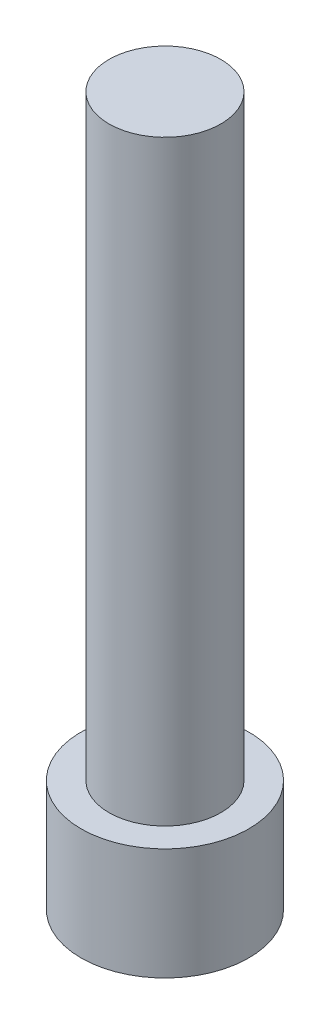
ISO-10303-21;
HEADER;
FILE_DESCRIPTION(('STEP AP214'),'2;1');
FILE_NAME('part.step','',(''),(''),'','','');
FILE_SCHEMA(('AUTOMOTIVE_DESIGN { 1 0 10303 214 1 1 1 1 }'));
ENDSEC;
DATA;
#1=APPLICATION_CONTEXT('core data for automotive mechanical design processes');
#2=APPLICATION_PROTOCOL_DEFINITION('international standard','automotive_design',2000,#1);
#3=PRODUCT_CONTEXT('',#1,'mechanical');
#4=PRODUCT('Part','Part','',(#3));
#5=PRODUCT_RELATED_PRODUCT_CATEGORY('part','',(#4));
#6=PRODUCT_DEFINITION_FORMATION('','',#4);
#7=PRODUCT_DEFINITION_CONTEXT('part definition',#1,'design');
#8=PRODUCT_DEFINITION('design','',#6,#7);
#9=PRODUCT_DEFINITION_SHAPE('','',#8);
#10=(LENGTH_UNIT() NAMED_UNIT(*) SI_UNIT(.MILLI.,.METRE.));
#11=(NAMED_UNIT(*) PLANE_ANGLE_UNIT() SI_UNIT($,.RADIAN.));
#12=(NAMED_UNIT(*) SI_UNIT($,.STERADIAN.) SOLID_ANGLE_UNIT());
#13=UNCERTAINTY_MEASURE_WITH_UNIT(LENGTH_MEASURE(1.E-05),#10,'distance_accuracy_value','');
#14=(GEOMETRIC_REPRESENTATION_CONTEXT(3) GLOBAL_UNCERTAINTY_ASSIGNED_CONTEXT((#13)) GLOBAL_UNIT_ASSIGNED_CONTEXT((#10,
#11,#12)) REPRESENTATION_CONTEXT('',''));
#15=CARTESIAN_POINT('',(0.,0.,0.));
#16=DIRECTION('',(0.,0.,1.));
#17=DIRECTION('',(1.,0.,0.));
#18=AXIS2_PLACEMENT_3D('',#15,#16,#17);
#19=CARTESIAN_POINT('',(0.,3.,0.));
#20=DIRECTION('',(0.,-1.,0.));
#21=DIRECTION('',(0.,0.,-1.));
#22=AXIS2_PLACEMENT_3D('',#19,#20,#21);
#23=CYLINDRICAL_SURFACE('',#22,2.25);
#24=CARTESIAN_POINT('',(0.,3.,0.));
#25=DIRECTION('',(0.,1.,0.));
#26=DIRECTION('',(0.,0.,1.));
#27=AXIS2_PLACEMENT_3D('',#24,#25,#26);
#28=CIRCLE('',#27,2.25);
#29=CARTESIAN_POINT('',(0.,3.,2.25));
#30=VERTEX_POINT('',#29);
#31=EDGE_CURVE('E51',#30,#30,#28,.T.);
#32=ORIENTED_EDGE('',*,*,#31,.F.);
#33=EDGE_LOOP('',(#32));
#34=FACE_BOUND('',#33,.T.);
#35=CARTESIAN_POINT('',(0.,0.,0.));
#36=DIRECTION('',(0.,1.,0.));
#37=DIRECTION('',(0.,0.,1.));
#38=AXIS2_PLACEMENT_3D('',#35,#36,#37);
#39=CIRCLE('',#38,2.25);
#40=CARTESIAN_POINT('',(0.,0.,2.25));
#41=VERTEX_POINT('',#40);
#42=EDGE_CURVE('E46',#41,#41,#39,.T.);
#43=ORIENTED_EDGE('',*,*,#42,.T.);
#44=EDGE_LOOP('',(#43));
#45=FACE_BOUND('',#44,.T.);
#46=ADVANCED_FACE('F43',(#34,#45),#23,.T.);
#47=CARTESIAN_POINT('',(0.,3.,0.));
#48=DIRECTION('',(0.,1.,0.));
#49=DIRECTION('',(0.,0.,1.));
#50=AXIS2_PLACEMENT_3D('',#47,#48,#49);
#51=PLANE('',#50);
#52=CARTESIAN_POINT('',(0.,3.,0.));
#53=DIRECTION('',(0.,1.,0.));
#54=DIRECTION('',(0.,0.,1.));
#55=AXIS2_PLACEMENT_3D('',#52,#53,#54);
#56=CIRCLE('',#55,1.5);
#57=CARTESIAN_POINT('',(0.,3.,1.5));
#58=VERTEX_POINT('',#57);
#59=EDGE_CURVE('E11',#58,#58,#56,.T.);
#60=ORIENTED_EDGE('',*,*,#59,.F.);
#61=EDGE_LOOP('',(#60));
#62=FACE_BOUND('',#61,.T.);
#63=ORIENTED_EDGE('',*,*,#31,.T.);
#64=EDGE_LOOP('',(#63));
#65=FACE_BOUND('',#64,.T.);
#66=ADVANCED_FACE('F162',(#62,#65),#51,.T.);
#67=CARTESIAN_POINT('',(0.,0.,0.));
#68=DIRECTION('',(0.,1.,0.));
#69=DIRECTION('',(0.,0.,1.));
#70=AXIS2_PLACEMENT_3D('',#67,#68,#69);
#71=PLANE('',#70);
#72=DIRECTION('',(0.188366587976478,0.,0.982098787563705));
#73=VECTOR('',#72,1.);
#74=CARTESIAN_POINT('',(1.09168160911144,0.,-0.944226984183985));
#75=LINE('',#74,#73);
#76=CARTESIAN_POINT('',(1.09168160911144,0.,-0.944226984183985));
#77=VERTEX_POINT('',#76);
#78=CARTESIAN_POINT('',(1.36356535979782,0.,0.47331051424279));
#79=VERTEX_POINT('',#78);
#80=EDGE_CURVE('E134',#77,#79,#75,.T.);
#81=ORIENTED_EDGE('',*,*,#80,.F.);
#82=DIRECTION('',(0.944705793044304,0.,0.327919143370027));
#83=VECTOR('',#82,1.);
#84=CARTESIAN_POINT('',(-0.271883750686377,0.,-1.41753749842678));
#85=LINE('',#84,#83);
#86=CARTESIAN_POINT('',(-0.271883750686377,0.,-1.41753749842678));
#87=VERTEX_POINT('',#86);
#88=EDGE_CURVE('E56',#87,#77,#85,.T.);
#89=ORIENTED_EDGE('',*,*,#88,.F.);
#90=DIRECTION('',(0.756339205067827,0.,-0.654179644193679));
#91=VECTOR('',#90,1.);
#92=CARTESIAN_POINT('',(-1.36356535979782,0.,-0.473310514242791));
#93=LINE('',#92,#91);
#94=CARTESIAN_POINT('',(-1.36356535979782,0.,-0.473310514242791));
#95=VERTEX_POINT('',#94);
#96=EDGE_CURVE('E142',#95,#87,#93,.T.);
#97=ORIENTED_EDGE('',*,*,#96,.F.);
#98=DIRECTION('',(-0.188366587976478,0.,-0.982098787563705));
#99=VECTOR('',#98,1.);
#100=CARTESIAN_POINT('',(-1.09168160911144,0.,0.944226984183986));
#101=LINE('',#100,#99);
#102=CARTESIAN_POINT('',(-1.09168160911144,0.,0.944226984183986));
#103=VERTEX_POINT('',#102);
#104=EDGE_CURVE('E137',#103,#95,#101,.T.);
#105=ORIENTED_EDGE('',*,*,#104,.F.);
#106=DIRECTION('',(-0.944705793044304,0.,-0.327919143370026));
#107=VECTOR('',#106,1.);
#108=CARTESIAN_POINT('',(0.271883750686377,0.,1.41753749842678));
#109=LINE('',#108,#107);
#110=CARTESIAN_POINT('',(0.271883750686377,0.,1.41753749842678));
#111=VERTEX_POINT('',#110);
#112=EDGE_CURVE('E110',#111,#103,#109,.T.);
#113=ORIENTED_EDGE('',*,*,#112,.F.);
#114=DIRECTION('',(-0.756339205067827,0.,0.654179644193679));
#115=VECTOR('',#114,1.);
#116=CARTESIAN_POINT('',(1.36356535979782,0.,0.47331051424279));
#117=LINE('',#116,#115);
#118=EDGE_CURVE('E139',#79,#111,#117,.T.);
#119=ORIENTED_EDGE('',*,*,#118,.F.);
#120=EDGE_LOOP('',(#81,#89,#97,#105,#113,#119));
#121=FACE_BOUND('',#120,.T.);
#122=ORIENTED_EDGE('',*,*,#42,.F.);
#123=EDGE_LOOP('',(#122));
#124=FACE_BOUND('',#123,.T.);
#125=ADVANCED_FACE('F159',(#121,#124),#71,.F.);
#126=CARTESIAN_POINT('',(0.,19.,0.));
#127=DIRECTION('',(0.,-1.,0.));
#128=DIRECTION('',(0.,0.,-1.));
#129=AXIS2_PLACEMENT_3D('',#126,#127,#128);
#130=CYLINDRICAL_SURFACE('',#129,1.5);
#131=CARTESIAN_POINT('',(0.,19.,0.));
#132=DIRECTION('',(0.,1.,0.));
#133=DIRECTION('',(0.,0.,1.));
#134=AXIS2_PLACEMENT_3D('',#131,#132,#133);
#135=CIRCLE('',#134,1.5);
#136=CARTESIAN_POINT('',(0.,19.,1.5));
#137=VERTEX_POINT('',#136);
#138=EDGE_CURVE('E148',#137,#137,#135,.T.);
#139=ORIENTED_EDGE('',*,*,#138,.F.);
#140=EDGE_LOOP('',(#139));
#141=FACE_BOUND('',#140,.T.);
#142=ORIENTED_EDGE('',*,*,#59,.T.);
#143=EDGE_LOOP('',(#142));
#144=FACE_BOUND('',#143,.T.);
#145=ADVANCED_FACE('F165',(#141,#144),#130,.T.);
#146=CARTESIAN_POINT('',(0.,19.,0.));
#147=DIRECTION('',(0.,1.,0.));
#148=DIRECTION('',(0.,0.,1.));
#149=AXIS2_PLACEMENT_3D('',#146,#147,#148);
#150=PLANE('',#149);
#151=ORIENTED_EDGE('',*,*,#138,.T.);
#152=EDGE_LOOP('',(#151));
#153=FACE_BOUND('',#152,.T.);
#154=ADVANCED_FACE('F168',(#153),#150,.T.);
#155=CARTESIAN_POINT('',(-0.271883750686377,1.5,-1.41753749842678));
#156=DIRECTION('',(0.327919143370027,0.,-0.944705793044304));
#157=DIRECTION('',(-0.944705793044304,0.,-0.327919143370027));
#158=AXIS2_PLACEMENT_3D('',#155,#156,#157);
#159=PLANE('',#158);
#160=ORIENTED_EDGE('',*,*,#88,.T.);
#161=DIRECTION('',(0.,-1.,0.));
#162=VECTOR('',#161,1.);
#163=CARTESIAN_POINT('',(1.09168160911144,1.5,-0.944226984183985));
#164=LINE('',#163,#162);
#165=CARTESIAN_POINT('',(1.09168160911144,1.5,-0.944226984183985));
#166=VERTEX_POINT('',#165);
#167=EDGE_CURVE('E90',#166,#77,#164,.T.);
#168=ORIENTED_EDGE('',*,*,#167,.F.);
#169=DIRECTION('',(0.944705793044304,0.,0.327919143370027));
#170=VECTOR('',#169,1.);
#171=CARTESIAN_POINT('',(-0.271883750686377,1.5,-1.41753749842678));
#172=LINE('',#171,#170);
#173=CARTESIAN_POINT('',(-0.271883750686377,1.5,-1.41753749842678));
#174=VERTEX_POINT('',#173);
#175=EDGE_CURVE('E145',#174,#166,#172,.T.);
#176=ORIENTED_EDGE('',*,*,#175,.F.);
#177=DIRECTION('',(0.,-1.,0.));
#178=VECTOR('',#177,1.);
#179=CARTESIAN_POINT('',(-0.271883750686377,1.5,-1.41753749842678));
#180=LINE('',#179,#178);
#181=EDGE_CURVE('E66',#174,#87,#180,.T.);
#182=ORIENTED_EDGE('',*,*,#181,.T.);
#183=EDGE_LOOP('',(#160,#168,#176,#182));
#184=FACE_BOUND('',#183,.T.);
#185=ADVANCED_FACE('F196',(#184),#159,.F.);
#186=CARTESIAN_POINT('',(-1.36356535979782,1.5,-0.473310514242791));
#187=DIRECTION('',(-0.654179644193679,0.,-0.756339205067826));
#188=DIRECTION('',(-0.756339205067827,0.,0.654179644193679));
#189=AXIS2_PLACEMENT_3D('',#186,#187,#188);
#190=PLANE('',#189);
#191=ORIENTED_EDGE('',*,*,#96,.T.);
#192=ORIENTED_EDGE('',*,*,#181,.F.);
#193=DIRECTION('',(0.756339205067827,0.,-0.654179644193679));
#194=VECTOR('',#193,1.);
#195=CARTESIAN_POINT('',(-1.36356535979782,1.5,-0.473310514242791));
#196=LINE('',#195,#194);
#197=CARTESIAN_POINT('',(-1.36356535979782,1.5,-0.473310514242791));
#198=VERTEX_POINT('',#197);
#199=EDGE_CURVE('E118',#198,#174,#196,.T.);
#200=ORIENTED_EDGE('',*,*,#199,.F.);
#201=DIRECTION('',(0.,-1.,0.));
#202=VECTOR('',#201,1.);
#203=CARTESIAN_POINT('',(-1.36356535979782,1.5,-0.473310514242791));
#204=LINE('',#203,#202);
#205=EDGE_CURVE('E112',#198,#95,#204,.T.);
#206=ORIENTED_EDGE('',*,*,#205,.T.);
#207=EDGE_LOOP('',(#191,#192,#200,#206));
#208=FACE_BOUND('',#207,.T.);
#209=ADVANCED_FACE('F209',(#208),#190,.F.);
#210=CARTESIAN_POINT('',(-1.09168160911144,1.5,0.944226984183986));
#211=DIRECTION('',(-0.982098787563705,0.,0.188366587976478));
#212=DIRECTION('',(0.188366587976478,0.,0.982098787563705));
#213=AXIS2_PLACEMENT_3D('',#210,#211,#212);
#214=PLANE('',#213);
#215=ORIENTED_EDGE('',*,*,#104,.T.);
#216=ORIENTED_EDGE('',*,*,#205,.F.);
#217=DIRECTION('',(-0.188366587976478,0.,-0.982098787563705));
#218=VECTOR('',#217,1.);
#219=CARTESIAN_POINT('',(-1.09168160911144,1.5,0.944226984183986));
#220=LINE('',#219,#218);
#221=CARTESIAN_POINT('',(-1.09168160911144,1.5,0.944226984183986));
#222=VERTEX_POINT('',#221);
#223=EDGE_CURVE('E113',#222,#198,#220,.T.);
#224=ORIENTED_EDGE('',*,*,#223,.F.);
#225=DIRECTION('',(0.,-1.,0.));
#226=VECTOR('',#225,1.);
#227=CARTESIAN_POINT('',(-1.09168160911144,1.5,0.944226984183986));
#228=LINE('',#227,#226);
#229=EDGE_CURVE('E99',#222,#103,#228,.T.);
#230=ORIENTED_EDGE('',*,*,#229,.T.);
#231=EDGE_LOOP('',(#215,#216,#224,#230));
#232=FACE_BOUND('',#231,.T.);
#233=ADVANCED_FACE('F116',(#232),#214,.F.);
#234=CARTESIAN_POINT('',(0.271883750686377,1.5,1.41753749842678));
#235=DIRECTION('',(-0.327919143370026,0.,0.944705793044304));
#236=DIRECTION('',(0.944705793044304,0.,0.327919143370026));
#237=AXIS2_PLACEMENT_3D('',#234,#235,#236);
#238=PLANE('',#237);
#239=ORIENTED_EDGE('',*,*,#112,.T.);
#240=ORIENTED_EDGE('',*,*,#229,.F.);
#241=DIRECTION('',(-0.944705793044304,0.,-0.327919143370026));
#242=VECTOR('',#241,1.);
#243=CARTESIAN_POINT('',(0.271883750686377,1.5,1.41753749842678));
#244=LINE('',#243,#242);
#245=CARTESIAN_POINT('',(0.271883750686377,1.5,1.41753749842678));
#246=VERTEX_POINT('',#245);
#247=EDGE_CURVE('E102',#246,#222,#244,.T.);
#248=ORIENTED_EDGE('',*,*,#247,.F.);
#249=DIRECTION('',(0.,-1.,0.));
#250=VECTOR('',#249,1.);
#251=CARTESIAN_POINT('',(0.271883750686377,1.5,1.41753749842678));
#252=LINE('',#251,#250);
#253=EDGE_CURVE('E115',#246,#111,#252,.T.);
#254=ORIENTED_EDGE('',*,*,#253,.T.);
#255=EDGE_LOOP('',(#239,#240,#248,#254));
#256=FACE_BOUND('',#255,.T.);
#257=ADVANCED_FACE('F105',(#256),#238,.F.);
#258=CARTESIAN_POINT('',(1.36356535979782,1.5,0.47331051424279));
#259=DIRECTION('',(0.654179644193679,0.,0.756339205067826));
#260=DIRECTION('',(0.756339205067827,0.,-0.654179644193679));
#261=AXIS2_PLACEMENT_3D('',#258,#259,#260);
#262=PLANE('',#261);
#263=ORIENTED_EDGE('',*,*,#118,.T.);
#264=ORIENTED_EDGE('',*,*,#253,.F.);
#265=DIRECTION('',(-0.756339205067827,0.,0.654179644193679));
#266=VECTOR('',#265,1.);
#267=CARTESIAN_POINT('',(1.36356535979782,1.5,0.47331051424279));
#268=LINE('',#267,#266);
#269=CARTESIAN_POINT('',(1.36356535979782,1.5,0.47331051424279));
#270=VERTEX_POINT('',#269);
#271=EDGE_CURVE('E122',#270,#246,#268,.T.);
#272=ORIENTED_EDGE('',*,*,#271,.F.);
#273=DIRECTION('',(0.,-1.,0.));
#274=VECTOR('',#273,1.);
#275=CARTESIAN_POINT('',(1.36356535979782,1.5,0.47331051424279));
#276=LINE('',#275,#274);
#277=EDGE_CURVE('E149',#270,#79,#276,.T.);
#278=ORIENTED_EDGE('',*,*,#277,.T.);
#279=EDGE_LOOP('',(#263,#264,#272,#278));
#280=FACE_BOUND('',#279,.T.);
#281=ADVANCED_FACE('F232',(#280),#262,.F.);
#282=CARTESIAN_POINT('',(1.09168160911144,1.5,-0.944226984183985));
#283=DIRECTION('',(0.982098787563705,0.,-0.188366587976477));
#284=DIRECTION('',(-0.188366587976477,0.,-0.982098787563705));
#285=AXIS2_PLACEMENT_3D('',#282,#283,#284);
#286=PLANE('',#285);
#287=ORIENTED_EDGE('',*,*,#80,.T.);
#288=ORIENTED_EDGE('',*,*,#277,.F.);
#289=DIRECTION('',(0.188366587976478,0.,0.982098787563705));
#290=VECTOR('',#289,1.);
#291=CARTESIAN_POINT('',(1.09168160911144,1.5,-0.944226984183985));
#292=LINE('',#291,#290);
#293=EDGE_CURVE('E130',#166,#270,#292,.T.);
#294=ORIENTED_EDGE('',*,*,#293,.F.);
#295=ORIENTED_EDGE('',*,*,#167,.T.);
#296=EDGE_LOOP('',(#287,#288,#294,#295));
#297=FACE_BOUND('',#296,.T.);
#298=ADVANCED_FACE('F243',(#297),#286,.F.);
#299=CARTESIAN_POINT('',(0.,1.5,0.));
#300=DIRECTION('',(0.,-1.,0.));
#301=DIRECTION('',(0.,0.,-1.));
#302=AXIS2_PLACEMENT_3D('',#299,#300,#301);
#303=PLANE('',#302);
#304=ORIENTED_EDGE('',*,*,#175,.T.);
#305=ORIENTED_EDGE('',*,*,#293,.T.);
#306=ORIENTED_EDGE('',*,*,#271,.T.);
#307=ORIENTED_EDGE('',*,*,#247,.T.);
#308=ORIENTED_EDGE('',*,*,#223,.T.);
#309=ORIENTED_EDGE('',*,*,#199,.T.);
#310=EDGE_LOOP('',(#304,#305,#306,#307,#308,#309));
#311=FACE_BOUND('',#310,.T.);
#312=ADVANCED_FACE('F121',(#311),#303,.T.);
#313=CLOSED_SHELL('',(#46,#66,#125,#145,#154,#185,#209,#233,#257,#281,#298,#312));
#314=MANIFOLD_SOLID_BREP('B2',#313);
#315=ADVANCED_BREP_SHAPE_REPRESENTATION('',(#18,#314),#14);
#316=SHAPE_DEFINITION_REPRESENTATION(#9,#315);
ENDSEC;
END-ISO-10303-21;
